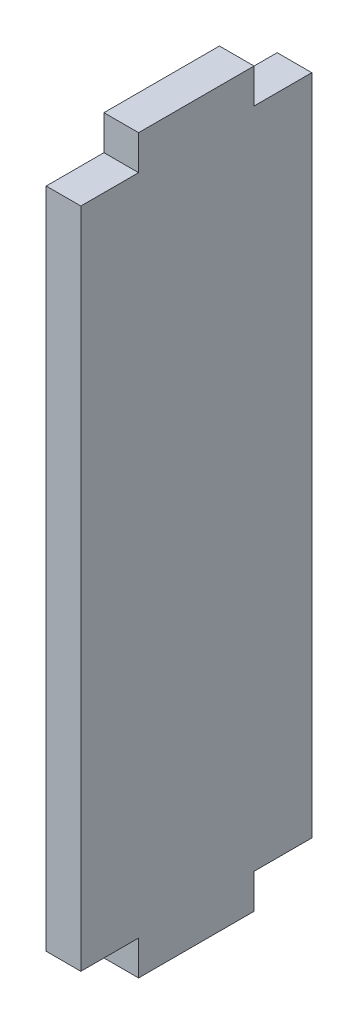
ISO-10303-21;
HEADER;
FILE_DESCRIPTION(('STEP AP214'),'2;1');
FILE_NAME('part.step','',(''),(''),'','','');
FILE_SCHEMA(('AUTOMOTIVE_DESIGN { 1 0 10303 214 1 1 1 1 }'));
ENDSEC;
DATA;
#1=APPLICATION_CONTEXT('core data for automotive mechanical design processes');
#2=APPLICATION_PROTOCOL_DEFINITION('international standard','automotive_design',2000,#1);
#3=PRODUCT_CONTEXT('',#1,'mechanical');
#4=PRODUCT('Part','Part','',(#3));
#5=PRODUCT_RELATED_PRODUCT_CATEGORY('part','',(#4));
#6=PRODUCT_DEFINITION_FORMATION('','',#4);
#7=PRODUCT_DEFINITION_CONTEXT('part definition',#1,'design');
#8=PRODUCT_DEFINITION('design','',#6,#7);
#9=PRODUCT_DEFINITION_SHAPE('','',#8);
#10=(LENGTH_UNIT() NAMED_UNIT(*) SI_UNIT(.MILLI.,.METRE.));
#11=(NAMED_UNIT(*) PLANE_ANGLE_UNIT() SI_UNIT($,.RADIAN.));
#12=(NAMED_UNIT(*) SI_UNIT($,.STERADIAN.) SOLID_ANGLE_UNIT());
#13=UNCERTAINTY_MEASURE_WITH_UNIT(LENGTH_MEASURE(1.E-05),#10,'distance_accuracy_value','');
#14=(GEOMETRIC_REPRESENTATION_CONTEXT(3) GLOBAL_UNCERTAINTY_ASSIGNED_CONTEXT((#13)) GLOBAL_UNIT_ASSIGNED_CONTEXT((#10,
#11,#12)) REPRESENTATION_CONTEXT('',''));
#15=CARTESIAN_POINT('',(0.,0.,0.));
#16=DIRECTION('',(0.,0.,1.));
#17=DIRECTION('',(1.,0.,0.));
#18=AXIS2_PLACEMENT_3D('',#15,#16,#17);
#19=CARTESIAN_POINT('',(3.,0.,15.));
#20=DIRECTION('',(0.,-1.,0.));
#21=DIRECTION('',(0.,0.,-1.));
#22=AXIS2_PLACEMENT_3D('',#19,#20,#21);
#23=PLANE('',#22);
#24=DIRECTION('',(0.,0.,1.));
#25=VECTOR('',#24,1.);
#26=CARTESIAN_POINT('',(0.,0.,15.));
#27=LINE('',#26,#25);
#28=CARTESIAN_POINT('',(0.,0.,15.));
#29=VERTEX_POINT('',#28);
#30=CARTESIAN_POINT('',(0.,0.,20.));
#31=VERTEX_POINT('',#30);
#32=EDGE_CURVE('E145',#29,#31,#27,.T.);
#33=ORIENTED_EDGE('',*,*,#32,.F.);
#34=DIRECTION('',(-1.,0.,0.));
#35=VECTOR('',#34,1.);
#36=CARTESIAN_POINT('',(3.,0.,15.));
#37=LINE('',#36,#35);
#38=CARTESIAN_POINT('',(3.,0.,15.));
#39=VERTEX_POINT('',#38);
#40=EDGE_CURVE('E32',#39,#29,#37,.T.);
#41=ORIENTED_EDGE('',*,*,#40,.F.);
#42=DIRECTION('',(0.,0.,1.));
#43=VECTOR('',#42,1.);
#44=CARTESIAN_POINT('',(3.,0.,15.));
#45=LINE('',#44,#43);
#46=CARTESIAN_POINT('',(3.,0.,20.));
#47=VERTEX_POINT('',#46);
#48=EDGE_CURVE('E136',#39,#47,#45,.T.);
#49=ORIENTED_EDGE('',*,*,#48,.T.);
#50=DIRECTION('',(-1.,0.,0.));
#51=VECTOR('',#50,1.);
#52=CARTESIAN_POINT('',(3.,0.,20.));
#53=LINE('',#52,#51);
#54=EDGE_CURVE('E10',#47,#31,#53,.T.);
#55=ORIENTED_EDGE('',*,*,#54,.T.);
#56=EDGE_LOOP('',(#33,#41,#49,#55));
#57=FACE_BOUND('',#56,.T.);
#58=ADVANCED_FACE('F16',(#57),#23,.T.);
#59=CARTESIAN_POINT('',(3.,0.,20.));
#60=DIRECTION('',(0.,0.,1.));
#61=DIRECTION('',(1.,0.,0.));
#62=AXIS2_PLACEMENT_3D('',#59,#60,#61);
#63=PLANE('',#62);
#64=DIRECTION('',(0.,1.,0.));
#65=VECTOR('',#64,1.);
#66=CARTESIAN_POINT('',(0.,0.,20.));
#67=LINE('',#66,#65);
#68=CARTESIAN_POINT('',(0.,57.4,20.));
#69=VERTEX_POINT('',#68);
#70=EDGE_CURVE('E140',#31,#69,#67,.T.);
#71=ORIENTED_EDGE('',*,*,#70,.F.);
#72=ORIENTED_EDGE('',*,*,#54,.F.);
#73=DIRECTION('',(0.,1.,0.));
#74=VECTOR('',#73,1.);
#75=CARTESIAN_POINT('',(3.,0.,20.));
#76=LINE('',#75,#74);
#77=CARTESIAN_POINT('',(3.,57.4,20.));
#78=VERTEX_POINT('',#77);
#79=EDGE_CURVE('E138',#47,#78,#76,.T.);
#80=ORIENTED_EDGE('',*,*,#79,.T.);
#81=DIRECTION('',(-1.,0.,0.));
#82=VECTOR('',#81,1.);
#83=CARTESIAN_POINT('',(3.,57.4,20.));
#84=LINE('',#83,#82);
#85=EDGE_CURVE('E24',#78,#69,#84,.T.);
#86=ORIENTED_EDGE('',*,*,#85,.T.);
#87=EDGE_LOOP('',(#71,#72,#80,#86));
#88=FACE_BOUND('',#87,.T.);
#89=ADVANCED_FACE('F198',(#88),#63,.T.);
#90=CARTESIAN_POINT('',(3.,57.4,20.));
#91=DIRECTION('',(0.,1.,0.));
#92=DIRECTION('',(0.,0.,1.));
#93=AXIS2_PLACEMENT_3D('',#90,#91,#92);
#94=PLANE('',#93);
#95=DIRECTION('',(0.,0.,-1.));
#96=VECTOR('',#95,1.);
#97=CARTESIAN_POINT('',(0.,57.4,20.));
#98=LINE('',#97,#96);
#99=CARTESIAN_POINT('',(0.,57.4,15.));
#100=VERTEX_POINT('',#99);
#101=EDGE_CURVE('E144',#69,#100,#98,.T.);
#102=ORIENTED_EDGE('',*,*,#101,.F.);
#103=ORIENTED_EDGE('',*,*,#85,.F.);
#104=DIRECTION('',(0.,0.,-1.));
#105=VECTOR('',#104,1.);
#106=CARTESIAN_POINT('',(3.,57.4,20.));
#107=LINE('',#106,#105);
#108=CARTESIAN_POINT('',(3.,57.4,15.));
#109=VERTEX_POINT('',#108);
#110=EDGE_CURVE('E207',#78,#109,#107,.T.);
#111=ORIENTED_EDGE('',*,*,#110,.T.);
#112=DIRECTION('',(-1.,0.,0.));
#113=VECTOR('',#112,1.);
#114=CARTESIAN_POINT('',(3.,57.4,15.));
#115=LINE('',#114,#113);
#116=EDGE_CURVE('E196',#109,#100,#115,.T.);
#117=ORIENTED_EDGE('',*,*,#116,.T.);
#118=EDGE_LOOP('',(#102,#103,#111,#117));
#119=FACE_BOUND('',#118,.T.);
#120=ADVANCED_FACE('F202',(#119),#94,.T.);
#121=CARTESIAN_POINT('',(3.,57.4,15.));
#122=DIRECTION('',(0.,0.,1.));
#123=DIRECTION('',(1.,0.,0.));
#124=AXIS2_PLACEMENT_3D('',#121,#122,#123);
#125=PLANE('',#124);
#126=DIRECTION('',(0.,1.,0.));
#127=VECTOR('',#126,1.);
#128=CARTESIAN_POINT('',(0.,57.4,15.));
#129=LINE('',#128,#127);
#130=CARTESIAN_POINT('',(0.,60.4,15.));
#131=VERTEX_POINT('',#130);
#132=EDGE_CURVE('E149',#100,#131,#129,.T.);
#133=ORIENTED_EDGE('',*,*,#132,.F.);
#134=ORIENTED_EDGE('',*,*,#116,.F.);
#135=DIRECTION('',(0.,1.,0.));
#136=VECTOR('',#135,1.);
#137=CARTESIAN_POINT('',(3.,57.4,15.));
#138=LINE('',#137,#136);
#139=CARTESIAN_POINT('',(3.,60.4,15.));
#140=VERTEX_POINT('',#139);
#141=EDGE_CURVE('E209',#109,#140,#138,.T.);
#142=ORIENTED_EDGE('',*,*,#141,.T.);
#143=DIRECTION('',(-1.,0.,0.));
#144=VECTOR('',#143,1.);
#145=CARTESIAN_POINT('',(3.,60.4,15.));
#146=LINE('',#145,#144);
#147=EDGE_CURVE('E194',#140,#131,#146,.T.);
#148=ORIENTED_EDGE('',*,*,#147,.T.);
#149=EDGE_LOOP('',(#133,#134,#142,#148));
#150=FACE_BOUND('',#149,.T.);
#151=ADVANCED_FACE('F245',(#150),#125,.T.);
#152=CARTESIAN_POINT('',(3.,60.4,15.));
#153=DIRECTION('',(0.,1.,0.));
#154=DIRECTION('',(0.,0.,1.));
#155=AXIS2_PLACEMENT_3D('',#152,#153,#154);
#156=PLANE('',#155);
#157=DIRECTION('',(0.,0.,-1.));
#158=VECTOR('',#157,1.);
#159=CARTESIAN_POINT('',(0.,60.4,15.));
#160=LINE('',#159,#158);
#161=CARTESIAN_POINT('',(0.,60.4,4.99999999999999));
#162=VERTEX_POINT('',#161);
#163=EDGE_CURVE('E153',#131,#162,#160,.T.);
#164=ORIENTED_EDGE('',*,*,#163,.F.);
#165=ORIENTED_EDGE('',*,*,#147,.F.);
#166=DIRECTION('',(0.,0.,-1.));
#167=VECTOR('',#166,1.);
#168=CARTESIAN_POINT('',(3.,60.4,15.));
#169=LINE('',#168,#167);
#170=CARTESIAN_POINT('',(3.,60.4,4.99999999999999));
#171=VERTEX_POINT('',#170);
#172=EDGE_CURVE('E214',#140,#171,#169,.T.);
#173=ORIENTED_EDGE('',*,*,#172,.T.);
#174=DIRECTION('',(-1.,0.,0.));
#175=VECTOR('',#174,1.);
#176=CARTESIAN_POINT('',(3.,60.4,4.99999999999999));
#177=LINE('',#176,#175);
#178=EDGE_CURVE('E192',#171,#162,#177,.T.);
#179=ORIENTED_EDGE('',*,*,#178,.T.);
#180=EDGE_LOOP('',(#164,#165,#173,#179));
#181=FACE_BOUND('',#180,.T.);
#182=ADVANCED_FACE('F243',(#181),#156,.T.);
#183=CARTESIAN_POINT('',(3.,60.4,4.99999999999999));
#184=DIRECTION('',(0.,0.,-1.));
#185=DIRECTION('',(-1.,0.,0.));
#186=AXIS2_PLACEMENT_3D('',#183,#184,#185);
#187=PLANE('',#186);
#188=DIRECTION('',(0.,-1.,0.));
#189=VECTOR('',#188,1.);
#190=CARTESIAN_POINT('',(0.,60.4,4.99999999999999));
#191=LINE('',#190,#189);
#192=CARTESIAN_POINT('',(0.,57.4,4.99999999999999));
#193=VERTEX_POINT('',#192);
#194=EDGE_CURVE('E157',#162,#193,#191,.T.);
#195=ORIENTED_EDGE('',*,*,#194,.F.);
#196=ORIENTED_EDGE('',*,*,#178,.F.);
#197=DIRECTION('',(0.,-1.,0.));
#198=VECTOR('',#197,1.);
#199=CARTESIAN_POINT('',(3.,60.4,4.99999999999999));
#200=LINE('',#199,#198);
#201=CARTESIAN_POINT('',(3.,57.4,4.99999999999999));
#202=VERTEX_POINT('',#201);
#203=EDGE_CURVE('E217',#171,#202,#200,.T.);
#204=ORIENTED_EDGE('',*,*,#203,.T.);
#205=DIRECTION('',(-1.,0.,0.));
#206=VECTOR('',#205,1.);
#207=CARTESIAN_POINT('',(3.,57.4,4.99999999999999));
#208=LINE('',#207,#206);
#209=EDGE_CURVE('E190',#202,#193,#208,.T.);
#210=ORIENTED_EDGE('',*,*,#209,.T.);
#211=EDGE_LOOP('',(#195,#196,#204,#210));
#212=FACE_BOUND('',#211,.T.);
#213=ADVANCED_FACE('F239',(#212),#187,.T.);
#214=CARTESIAN_POINT('',(3.,57.4,4.99999999999999));
#215=DIRECTION('',(0.,1.,0.));
#216=DIRECTION('',(0.,0.,1.));
#217=AXIS2_PLACEMENT_3D('',#214,#215,#216);
#218=PLANE('',#217);
#219=DIRECTION('',(0.,0.,-1.));
#220=VECTOR('',#219,1.);
#221=CARTESIAN_POINT('',(0.,57.4,4.99999999999999));
#222=LINE('',#221,#220);
#223=CARTESIAN_POINT('',(0.,57.4,0.));
#224=VERTEX_POINT('',#223);
#225=EDGE_CURVE('E161',#193,#224,#222,.T.);
#226=ORIENTED_EDGE('',*,*,#225,.F.);
#227=ORIENTED_EDGE('',*,*,#209,.F.);
#228=DIRECTION('',(0.,0.,-1.));
#229=VECTOR('',#228,1.);
#230=CARTESIAN_POINT('',(3.,57.4,4.99999999999999));
#231=LINE('',#230,#229);
#232=CARTESIAN_POINT('',(3.,57.4,0.));
#233=VERTEX_POINT('',#232);
#234=EDGE_CURVE('E220',#202,#233,#231,.T.);
#235=ORIENTED_EDGE('',*,*,#234,.T.);
#236=DIRECTION('',(-1.,0.,0.));
#237=VECTOR('',#236,1.);
#238=CARTESIAN_POINT('',(3.,57.4,0.));
#239=LINE('',#238,#237);
#240=EDGE_CURVE('E188',#233,#224,#239,.T.);
#241=ORIENTED_EDGE('',*,*,#240,.T.);
#242=EDGE_LOOP('',(#226,#227,#235,#241));
#243=FACE_BOUND('',#242,.T.);
#244=ADVANCED_FACE('F236',(#243),#218,.T.);
#245=CARTESIAN_POINT('',(3.,57.4,0.));
#246=DIRECTION('',(0.,0.,-1.));
#247=DIRECTION('',(0.,1.,0.));
#248=AXIS2_PLACEMENT_3D('',#245,#246,#247);
#249=PLANE('',#248);
#250=DIRECTION('',(0.,-1.,0.));
#251=VECTOR('',#250,1.);
#252=CARTESIAN_POINT('',(0.,57.4,0.));
#253=LINE('',#252,#251);
#254=CARTESIAN_POINT('',(0.,0.,0.));
#255=VERTEX_POINT('',#254);
#256=EDGE_CURVE('E165',#224,#255,#253,.T.);
#257=ORIENTED_EDGE('',*,*,#256,.F.);
#258=ORIENTED_EDGE('',*,*,#240,.F.);
#259=DIRECTION('',(0.,-1.,0.));
#260=VECTOR('',#259,1.);
#261=CARTESIAN_POINT('',(3.,57.4,0.));
#262=LINE('',#261,#260);
#263=CARTESIAN_POINT('',(3.,0.,0.));
#264=VERTEX_POINT('',#263);
#265=EDGE_CURVE('E223',#233,#264,#262,.T.);
#266=ORIENTED_EDGE('',*,*,#265,.T.);
#267=DIRECTION('',(-1.,0.,0.));
#268=VECTOR('',#267,1.);
#269=CARTESIAN_POINT('',(3.,0.,0.));
#270=LINE('',#269,#268);
#271=EDGE_CURVE('E186',#264,#255,#270,.T.);
#272=ORIENTED_EDGE('',*,*,#271,.T.);
#273=EDGE_LOOP('',(#257,#258,#266,#272));
#274=FACE_BOUND('',#273,.T.);
#275=ADVANCED_FACE('F233',(#274),#249,.T.);
#276=CARTESIAN_POINT('',(3.,0.,0.));
#277=DIRECTION('',(0.,-1.,0.));
#278=DIRECTION('',(0.,0.,-1.));
#279=AXIS2_PLACEMENT_3D('',#276,#277,#278);
#280=PLANE('',#279);
#281=DIRECTION('',(0.,0.,1.));
#282=VECTOR('',#281,1.);
#283=CARTESIAN_POINT('',(0.,0.,0.));
#284=LINE('',#283,#282);
#285=CARTESIAN_POINT('',(0.,0.,5.));
#286=VERTEX_POINT('',#285);
#287=EDGE_CURVE('E169',#255,#286,#284,.T.);
#288=ORIENTED_EDGE('',*,*,#287,.F.);
#289=ORIENTED_EDGE('',*,*,#271,.F.);
#290=DIRECTION('',(0.,0.,1.));
#291=VECTOR('',#290,1.);
#292=CARTESIAN_POINT('',(3.,0.,0.));
#293=LINE('',#292,#291);
#294=CARTESIAN_POINT('',(3.,0.,5.));
#295=VERTEX_POINT('',#294);
#296=EDGE_CURVE('E127',#264,#295,#293,.T.);
#297=ORIENTED_EDGE('',*,*,#296,.T.);
#298=DIRECTION('',(-1.,0.,0.));
#299=VECTOR('',#298,1.);
#300=CARTESIAN_POINT('',(3.,0.,5.));
#301=LINE('',#300,#299);
#302=EDGE_CURVE('E119',#295,#286,#301,.T.);
#303=ORIENTED_EDGE('',*,*,#302,.T.);
#304=EDGE_LOOP('',(#288,#289,#297,#303));
#305=FACE_BOUND('',#304,.T.);
#306=ADVANCED_FACE('F227',(#305),#280,.T.);
#307=CARTESIAN_POINT('',(3.,0.,5.));
#308=DIRECTION('',(0.,0.,-1.));
#309=DIRECTION('',(-1.,0.,0.));
#310=AXIS2_PLACEMENT_3D('',#307,#308,#309);
#311=PLANE('',#310);
#312=DIRECTION('',(0.,-1.,0.));
#313=VECTOR('',#312,1.);
#314=CARTESIAN_POINT('',(0.,0.,5.));
#315=LINE('',#314,#313);
#316=CARTESIAN_POINT('',(0.,-3.,5.));
#317=VERTEX_POINT('',#316);
#318=EDGE_CURVE('E173',#286,#317,#315,.T.);
#319=ORIENTED_EDGE('',*,*,#318,.F.);
#320=ORIENTED_EDGE('',*,*,#302,.F.);
#321=DIRECTION('',(0.,-1.,0.));
#322=VECTOR('',#321,1.);
#323=CARTESIAN_POINT('',(3.,0.,5.));
#324=LINE('',#323,#322);
#325=CARTESIAN_POINT('',(3.,-3.,5.));
#326=VERTEX_POINT('',#325);
#327=EDGE_CURVE('E122',#295,#326,#324,.T.);
#328=ORIENTED_EDGE('',*,*,#327,.T.);
#329=DIRECTION('',(-1.,0.,0.));
#330=VECTOR('',#329,1.);
#331=CARTESIAN_POINT('',(3.,-3.,5.));
#332=LINE('',#331,#330);
#333=EDGE_CURVE('E108',#326,#317,#332,.T.);
#334=ORIENTED_EDGE('',*,*,#333,.T.);
#335=EDGE_LOOP('',(#319,#320,#328,#334));
#336=FACE_BOUND('',#335,.T.);
#337=ADVANCED_FACE('F123',(#336),#311,.T.);
#338=CARTESIAN_POINT('',(3.,-3.,5.));
#339=DIRECTION('',(0.,-1.,0.));
#340=DIRECTION('',(0.,0.,-1.));
#341=AXIS2_PLACEMENT_3D('',#338,#339,#340);
#342=PLANE('',#341);
#343=DIRECTION('',(0.,0.,1.));
#344=VECTOR('',#343,1.);
#345=CARTESIAN_POINT('',(0.,-3.,5.));
#346=LINE('',#345,#344);
#347=CARTESIAN_POINT('',(0.,-3.,15.));
#348=VERTEX_POINT('',#347);
#349=EDGE_CURVE('E115',#317,#348,#346,.T.);
#350=ORIENTED_EDGE('',*,*,#349,.F.);
#351=ORIENTED_EDGE('',*,*,#333,.F.);
#352=DIRECTION('',(0.,0.,1.));
#353=VECTOR('',#352,1.);
#354=CARTESIAN_POINT('',(3.,-3.,5.));
#355=LINE('',#354,#353);
#356=CARTESIAN_POINT('',(3.,-3.,15.));
#357=VERTEX_POINT('',#356);
#358=EDGE_CURVE('E112',#326,#357,#355,.T.);
#359=ORIENTED_EDGE('',*,*,#358,.T.);
#360=DIRECTION('',(-1.,0.,0.));
#361=VECTOR('',#360,1.);
#362=CARTESIAN_POINT('',(3.,-3.,15.));
#363=LINE('',#362,#361);
#364=EDGE_CURVE('E72',#357,#348,#363,.T.);
#365=ORIENTED_EDGE('',*,*,#364,.T.);
#366=EDGE_LOOP('',(#350,#351,#359,#365));
#367=FACE_BOUND('',#366,.T.);
#368=ADVANCED_FACE('F110',(#367),#342,.T.);
#369=CARTESIAN_POINT('',(3.,-3.,15.));
#370=DIRECTION('',(0.,0.,1.));
#371=DIRECTION('',(1.,0.,0.));
#372=AXIS2_PLACEMENT_3D('',#369,#370,#371);
#373=PLANE('',#372);
#374=DIRECTION('',(0.,1.,0.));
#375=VECTOR('',#374,1.);
#376=CARTESIAN_POINT('',(0.,-3.,15.));
#377=LINE('',#376,#375);
#378=EDGE_CURVE('E139',#348,#29,#377,.T.);
#379=ORIENTED_EDGE('',*,*,#378,.F.);
#380=ORIENTED_EDGE('',*,*,#364,.F.);
#381=DIRECTION('',(0.,1.,0.));
#382=VECTOR('',#381,1.);
#383=CARTESIAN_POINT('',(3.,-3.,15.));
#384=LINE('',#383,#382);
#385=EDGE_CURVE('E131',#357,#39,#384,.T.);
#386=ORIENTED_EDGE('',*,*,#385,.T.);
#387=ORIENTED_EDGE('',*,*,#40,.T.);
#388=EDGE_LOOP('',(#379,#380,#386,#387));
#389=FACE_BOUND('',#388,.T.);
#390=ADVANCED_FACE('F337',(#389),#373,.T.);
#391=CARTESIAN_POINT('',(3.,0.,0.));
#392=DIRECTION('',(-1.,0.,0.));
#393=DIRECTION('',(0.,-1.,0.));
#394=AXIS2_PLACEMENT_3D('',#391,#392,#393);
#395=PLANE('',#394);
#396=ORIENTED_EDGE('',*,*,#48,.F.);
#397=ORIENTED_EDGE('',*,*,#385,.F.);
#398=ORIENTED_EDGE('',*,*,#358,.F.);
#399=ORIENTED_EDGE('',*,*,#327,.F.);
#400=ORIENTED_EDGE('',*,*,#296,.F.);
#401=ORIENTED_EDGE('',*,*,#265,.F.);
#402=ORIENTED_EDGE('',*,*,#234,.F.);
#403=ORIENTED_EDGE('',*,*,#203,.F.);
#404=ORIENTED_EDGE('',*,*,#172,.F.);
#405=ORIENTED_EDGE('',*,*,#141,.F.);
#406=ORIENTED_EDGE('',*,*,#110,.F.);
#407=ORIENTED_EDGE('',*,*,#79,.F.);
#408=EDGE_LOOP('',(#396,#397,#398,#399,#400,#401,#402,#403,#404,#405,#406,#407));
#409=FACE_BOUND('',#408,.T.);
#410=ADVANCED_FACE('F130',(#409),#395,.F.);
#411=CARTESIAN_POINT('',(0.,0.,0.));
#412=DIRECTION('',(-1.,0.,0.));
#413=DIRECTION('',(0.,-1.,0.));
#414=AXIS2_PLACEMENT_3D('',#411,#412,#413);
#415=PLANE('',#414);
#416=ORIENTED_EDGE('',*,*,#32,.T.);
#417=ORIENTED_EDGE('',*,*,#70,.T.);
#418=ORIENTED_EDGE('',*,*,#101,.T.);
#419=ORIENTED_EDGE('',*,*,#132,.T.);
#420=ORIENTED_EDGE('',*,*,#163,.T.);
#421=ORIENTED_EDGE('',*,*,#194,.T.);
#422=ORIENTED_EDGE('',*,*,#225,.T.);
#423=ORIENTED_EDGE('',*,*,#256,.T.);
#424=ORIENTED_EDGE('',*,*,#287,.T.);
#425=ORIENTED_EDGE('',*,*,#318,.T.);
#426=ORIENTED_EDGE('',*,*,#349,.T.);
#427=ORIENTED_EDGE('',*,*,#378,.T.);
#428=EDGE_LOOP('',(#416,#417,#418,#419,#420,#421,#422,#423,#424,#425,#426,#427));
#429=FACE_BOUND('',#428,.T.);
#430=ADVANCED_FACE('F205',(#429),#415,.T.);
#431=CLOSED_SHELL('',(#58,#89,#120,#151,#182,#213,#244,#275,#306,#337,#368,#390,#410,#430));
#432=MANIFOLD_SOLID_BREP('B1',#431);
#433=ADVANCED_BREP_SHAPE_REPRESENTATION('',(#18,#432),#14);
#434=SHAPE_DEFINITION_REPRESENTATION(#9,#433);
ENDSEC;
END-ISO-10303-21;
